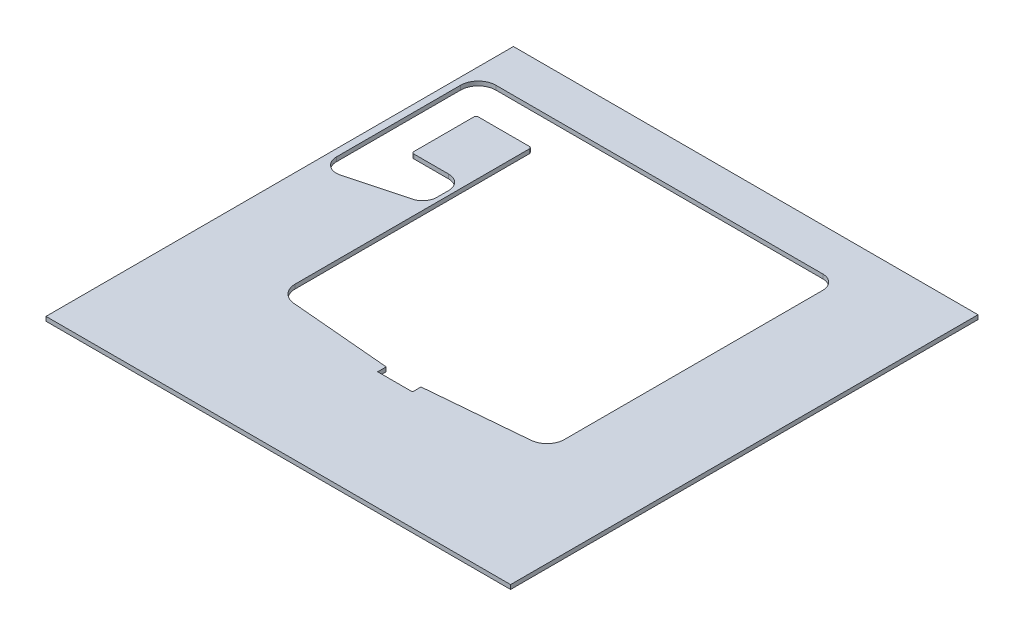
ISO-10303-21;
HEADER;
FILE_DESCRIPTION(('STEP AP214'),'2;1');
FILE_NAME('part.step','',(''),(''),'','','');
FILE_SCHEMA(('AUTOMOTIVE_DESIGN { 1 0 10303 214 1 1 1 1 }'));
ENDSEC;
DATA;
#1=APPLICATION_CONTEXT('core data for automotive mechanical design processes');
#2=APPLICATION_PROTOCOL_DEFINITION('international standard','automotive_design',2000,#1);
#3=PRODUCT_CONTEXT('',#1,'mechanical');
#4=PRODUCT('Part','Part','',(#3));
#5=PRODUCT_RELATED_PRODUCT_CATEGORY('part','',(#4));
#6=PRODUCT_DEFINITION_FORMATION('','',#4);
#7=PRODUCT_DEFINITION_CONTEXT('part definition',#1,'design');
#8=PRODUCT_DEFINITION('design','',#6,#7);
#9=PRODUCT_DEFINITION_SHAPE('','',#8);
#10=(LENGTH_UNIT() NAMED_UNIT(*) SI_UNIT(.MILLI.,.METRE.));
#11=(NAMED_UNIT(*) PLANE_ANGLE_UNIT() SI_UNIT($,.RADIAN.));
#12=(NAMED_UNIT(*) SI_UNIT($,.STERADIAN.) SOLID_ANGLE_UNIT());
#13=UNCERTAINTY_MEASURE_WITH_UNIT(LENGTH_MEASURE(1.E-05),#10,'distance_accuracy_value','');
#14=(GEOMETRIC_REPRESENTATION_CONTEXT(3) GLOBAL_UNCERTAINTY_ASSIGNED_CONTEXT((#13)) GLOBAL_UNIT_ASSIGNED_CONTEXT((#10,
#11,#12)) REPRESENTATION_CONTEXT('',''));
#15=CARTESIAN_POINT('',(0.,0.,0.));
#16=DIRECTION('',(0.,0.,1.));
#17=DIRECTION('',(1.,0.,0.));
#18=AXIS2_PLACEMENT_3D('',#15,#16,#17);
#19=CARTESIAN_POINT('',(0.,866.531199898518,304.23));
#20=DIRECTION('',(0.,0.,-1.));
#21=DIRECTION('',(-1.,0.,0.));
#22=AXIS2_PLACEMENT_3D('',#19,#20,#21);
#23=PLANE('',#22);
#24=DIRECTION('',(1.,0.,0.));
#25=VECTOR('',#24,1.);
#26=CARTESIAN_POINT('',(0.,12.,304.23));
#27=LINE('',#26,#25);
#28=CARTESIAN_POINT('',(-300.,12.,304.23));
#29=VERTEX_POINT('',#28);
#30=CARTESIAN_POINT('',(354.,12.,304.23));
#31=VERTEX_POINT('',#30);
#32=EDGE_CURVE('E314',#29,#31,#27,.T.);
#33=ORIENTED_EDGE('',*,*,#32,.F.);
#34=DIRECTION('',(0.,-1.,0.));
#35=VECTOR('',#34,1.);
#36=CARTESIAN_POINT('',(-300.,866.531199898518,304.23));
#37=LINE('',#36,#35);
#38=CARTESIAN_POINT('',(-300.,6.,304.23));
#39=VERTEX_POINT('',#38);
#40=EDGE_CURVE('E206',#29,#39,#37,.T.);
#41=ORIENTED_EDGE('',*,*,#40,.T.);
#42=DIRECTION('',(1.,0.,0.));
#43=VECTOR('',#42,1.);
#44=CARTESIAN_POINT('',(0.,6.,304.23));
#45=LINE('',#44,#43);
#46=CARTESIAN_POINT('',(354.,6.,304.23));
#47=VERTEX_POINT('',#46);
#48=EDGE_CURVE('E201',#39,#47,#45,.T.);
#49=ORIENTED_EDGE('',*,*,#48,.T.);
#50=DIRECTION('',(0.,1.,0.));
#51=VECTOR('',#50,1.);
#52=CARTESIAN_POINT('',(354.,6.,304.23));
#53=LINE('',#52,#51);
#54=EDGE_CURVE('E204',#47,#31,#53,.T.);
#55=ORIENTED_EDGE('',*,*,#54,.T.);
#56=EDGE_LOOP('',(#33,#41,#49,#55));
#57=FACE_BOUND('',#56,.T.);
#58=ADVANCED_FACE('F17',(#57),#23,.F.);
#59=CARTESIAN_POINT('',(-167.,866.531199898518,-240.23));
#60=DIRECTION('',(0.,-1.,0.));
#61=DIRECTION('',(0.,0.,-1.));
#62=AXIS2_PLACEMENT_3D('',#59,#60,#61);
#63=CYLINDRICAL_SURFACE('',#62,2.99999999999996);
#64=DIRECTION('',(0.,-1.,0.));
#65=VECTOR('',#64,1.);
#66=CARTESIAN_POINT('',(-167.,866.531199898518,-243.23));
#67=LINE('',#66,#65);
#68=CARTESIAN_POINT('',(-167.,12.,-243.23));
#69=VERTEX_POINT('',#68);
#70=CARTESIAN_POINT('',(-167.,6.,-243.23));
#71=VERTEX_POINT('',#70);
#72=EDGE_CURVE('E307',#69,#71,#67,.T.);
#73=ORIENTED_EDGE('',*,*,#72,.F.);
#74=CARTESIAN_POINT('',(-167.,12.,-240.23));
#75=DIRECTION('',(0.,1.,0.));
#76=DIRECTION('',(0.,0.,1.));
#77=AXIS2_PLACEMENT_3D('',#74,#75,#76);
#78=CIRCLE('',#77,2.99999999999996);
#79=CARTESIAN_POINT('',(-164.,12.,-240.23));
#80=VERTEX_POINT('',#79);
#81=EDGE_CURVE('E210',#69,#80,#78,.F.);
#82=ORIENTED_EDGE('',*,*,#81,.T.);
#83=DIRECTION('',(0.,-1.,0.));
#84=VECTOR('',#83,1.);
#85=CARTESIAN_POINT('',(-164.,866.531199898518,-240.23));
#86=LINE('',#85,#84);
#87=CARTESIAN_POINT('',(-164.,6.,-240.23));
#88=VERTEX_POINT('',#87);
#89=EDGE_CURVE('E320',#80,#88,#86,.T.);
#90=ORIENTED_EDGE('',*,*,#89,.T.);
#91=CARTESIAN_POINT('',(-167.,6.,-240.23));
#92=DIRECTION('',(0.,1.,0.));
#93=DIRECTION('',(0.,0.,1.));
#94=AXIS2_PLACEMENT_3D('',#91,#92,#93);
#95=CIRCLE('',#94,2.99999999999996);
#96=EDGE_CURVE('E236',#71,#88,#95,.F.);
#97=ORIENTED_EDGE('',*,*,#96,.F.);
#98=EDGE_LOOP('',(#73,#82,#90,#97));
#99=FACE_BOUND('',#98,.T.);
#100=ADVANCED_FACE('F479',(#99),#63,.T.);
#101=CARTESIAN_POINT('',(0.,866.531199898518,-243.23));
#102=DIRECTION('',(0.,0.,1.));
#103=DIRECTION('',(1.,0.,0.));
#104=AXIS2_PLACEMENT_3D('',#101,#102,#103);
#105=PLANE('',#104);
#106=DIRECTION('',(-1.,0.,0.));
#107=VECTOR('',#106,1.);
#108=CARTESIAN_POINT('',(0.,12.,-243.23));
#109=LINE('',#108,#107);
#110=CARTESIAN_POINT('',(-239.,12.,-243.23));
#111=VERTEX_POINT('',#110);
#112=EDGE_CURVE('E280',#69,#111,#109,.T.);
#113=ORIENTED_EDGE('',*,*,#112,.F.);
#114=ORIENTED_EDGE('',*,*,#72,.T.);
#115=DIRECTION('',(-1.,0.,0.));
#116=VECTOR('',#115,1.);
#117=CARTESIAN_POINT('',(0.,6.,-243.23));
#118=LINE('',#117,#116);
#119=CARTESIAN_POINT('',(-239.,6.,-243.23));
#120=VERTEX_POINT('',#119);
#121=EDGE_CURVE('E304',#71,#120,#118,.T.);
#122=ORIENTED_EDGE('',*,*,#121,.T.);
#123=DIRECTION('',(0.,-1.,0.));
#124=VECTOR('',#123,1.);
#125=CARTESIAN_POINT('',(-239.,866.531199898518,-243.23));
#126=LINE('',#125,#124);
#127=EDGE_CURVE('E303',#111,#120,#126,.T.);
#128=ORIENTED_EDGE('',*,*,#127,.F.);
#129=EDGE_LOOP('',(#113,#114,#122,#128));
#130=FACE_BOUND('',#129,.T.);
#131=ADVANCED_FACE('F489',(#130),#105,.F.);
#132=CARTESIAN_POINT('',(-239.,866.531199898518,-240.23));
#133=DIRECTION('',(0.,-1.,0.));
#134=DIRECTION('',(0.,0.,-1.));
#135=AXIS2_PLACEMENT_3D('',#132,#133,#134);
#136=CYLINDRICAL_SURFACE('',#135,3.00000000000005);
#137=CARTESIAN_POINT('',(-239.,12.,-240.23));
#138=DIRECTION('',(0.,1.,0.));
#139=DIRECTION('',(0.,0.,1.));
#140=AXIS2_PLACEMENT_3D('',#137,#138,#139);
#141=CIRCLE('',#140,3.00000000000005);
#142=CARTESIAN_POINT('',(-242.,12.,-240.23));
#143=VERTEX_POINT('',#142);
#144=EDGE_CURVE('E322',#111,#143,#141,.T.);
#145=ORIENTED_EDGE('',*,*,#144,.F.);
#146=ORIENTED_EDGE('',*,*,#127,.T.);
#147=CARTESIAN_POINT('',(-239.,6.,-240.23));
#148=DIRECTION('',(0.,1.,0.));
#149=DIRECTION('',(0.,0.,1.));
#150=AXIS2_PLACEMENT_3D('',#147,#148,#149);
#151=CIRCLE('',#150,3.00000000000005);
#152=CARTESIAN_POINT('',(-242.,6.,-240.23));
#153=VERTEX_POINT('',#152);
#154=EDGE_CURVE('E300',#120,#153,#151,.T.);
#155=ORIENTED_EDGE('',*,*,#154,.T.);
#156=DIRECTION('',(0.,-1.,0.));
#157=VECTOR('',#156,1.);
#158=CARTESIAN_POINT('',(-242.,866.531199898518,-240.23));
#159=LINE('',#158,#157);
#160=EDGE_CURVE('E299',#143,#153,#159,.T.);
#161=ORIENTED_EDGE('',*,*,#160,.F.);
#162=EDGE_LOOP('',(#145,#146,#155,#161));
#163=FACE_BOUND('',#162,.T.);
#164=ADVANCED_FACE('F495',(#163),#136,.T.);
#165=CARTESIAN_POINT('',(-242.,866.531199898518,0.));
#166=DIRECTION('',(1.,0.,0.));
#167=DIRECTION('',(0.,0.,-1.));
#168=AXIS2_PLACEMENT_3D('',#165,#166,#167);
#169=PLANE('',#168);
#170=DIRECTION('',(0.,0.,1.));
#171=VECTOR('',#170,1.);
#172=CARTESIAN_POINT('',(-242.,12.,0.));
#173=LINE('',#172,#171);
#174=CARTESIAN_POINT('',(-242.,12.,-155.671883561144));
#175=VERTEX_POINT('',#174);
#176=EDGE_CURVE('E324',#143,#175,#173,.T.);
#177=ORIENTED_EDGE('',*,*,#176,.F.);
#178=ORIENTED_EDGE('',*,*,#160,.T.);
#179=DIRECTION('',(0.,0.,1.));
#180=VECTOR('',#179,1.);
#181=CARTESIAN_POINT('',(-242.,6.,0.));
#182=LINE('',#181,#180);
#183=CARTESIAN_POINT('',(-242.,6.,-155.671883561144));
#184=VERTEX_POINT('',#183);
#185=EDGE_CURVE('E296',#153,#184,#182,.T.);
#186=ORIENTED_EDGE('',*,*,#185,.T.);
#187=DIRECTION('',(0.,-1.,0.));
#188=VECTOR('',#187,1.);
#189=CARTESIAN_POINT('',(-242.,866.531199898518,-155.671883561144));
#190=LINE('',#189,#188);
#191=EDGE_CURVE('E295',#175,#184,#190,.T.);
#192=ORIENTED_EDGE('',*,*,#191,.F.);
#193=EDGE_LOOP('',(#177,#178,#186,#192));
#194=FACE_BOUND('',#193,.T.);
#195=ADVANCED_FACE('F497',(#194),#169,.F.);
#196=CARTESIAN_POINT('',(-239.,866.531199898518,-155.671883561144));
#197=DIRECTION('',(0.,-1.,0.));
#198=DIRECTION('',(0.,0.,-1.));
#199=AXIS2_PLACEMENT_3D('',#196,#197,#198);
#200=CYLINDRICAL_SURFACE('',#199,3.00000000000006);
#201=CARTESIAN_POINT('',(-239.,12.,-155.671883561144));
#202=DIRECTION('',(0.,1.,0.));
#203=DIRECTION('',(0.,0.,1.));
#204=AXIS2_PLACEMENT_3D('',#201,#202,#203);
#205=CIRCLE('',#204,3.00000000000006);
#206=CARTESIAN_POINT('',(-239.,12.,-152.671883561143));
#207=VERTEX_POINT('',#206);
#208=EDGE_CURVE('E326',#175,#207,#205,.T.);
#209=ORIENTED_EDGE('',*,*,#208,.F.);
#210=ORIENTED_EDGE('',*,*,#191,.T.);
#211=CARTESIAN_POINT('',(-239.,6.,-155.671883561144));
#212=DIRECTION('',(0.,1.,0.));
#213=DIRECTION('',(0.,0.,1.));
#214=AXIS2_PLACEMENT_3D('',#211,#212,#213);
#215=CIRCLE('',#214,3.00000000000006);
#216=CARTESIAN_POINT('',(-239.,6.,-152.671883561143));
#217=VERTEX_POINT('',#216);
#218=EDGE_CURVE('E292',#184,#217,#215,.T.);
#219=ORIENTED_EDGE('',*,*,#218,.T.);
#220=DIRECTION('',(0.,-1.,0.));
#221=VECTOR('',#220,1.);
#222=CARTESIAN_POINT('',(-239.,866.531199898518,-152.671883561143));
#223=LINE('',#222,#221);
#224=EDGE_CURVE('E291',#207,#217,#223,.T.);
#225=ORIENTED_EDGE('',*,*,#224,.F.);
#226=EDGE_LOOP('',(#209,#210,#219,#225));
#227=FACE_BOUND('',#226,.T.);
#228=ADVANCED_FACE('F502',(#227),#200,.T.);
#229=CARTESIAN_POINT('',(0.,866.531199898518,-152.671883561143));
#230=DIRECTION('',(0.,0.,-1.));
#231=DIRECTION('',(-1.,0.,0.));
#232=AXIS2_PLACEMENT_3D('',#229,#230,#231);
#233=PLANE('',#232);
#234=DIRECTION('',(1.,0.,0.));
#235=VECTOR('',#234,1.);
#236=CARTESIAN_POINT('',(0.,6.,-152.671883561143));
#237=LINE('',#236,#235);
#238=CARTESIAN_POINT('',(-190.,6.,-152.671883561143));
#239=VERTEX_POINT('',#238);
#240=EDGE_CURVE('E288',#217,#239,#237,.T.);
#241=ORIENTED_EDGE('',*,*,#240,.T.);
#242=DIRECTION('',(0.,-1.,0.));
#243=VECTOR('',#242,1.);
#244=CARTESIAN_POINT('',(-190.,12.,-152.671883561143));
#245=LINE('',#244,#243);
#246=CARTESIAN_POINT('',(-190.,12.,-152.671883561143));
#247=VERTEX_POINT('',#246);
#248=EDGE_CURVE('E388',#239,#247,#245,.F.);
#249=ORIENTED_EDGE('',*,*,#248,.T.);
#250=DIRECTION('',(1.,0.,0.));
#251=VECTOR('',#250,1.);
#252=CARTESIAN_POINT('',(0.,12.,-152.671883561143));
#253=LINE('',#252,#251);
#254=EDGE_CURVE('E328',#207,#247,#253,.T.);
#255=ORIENTED_EDGE('',*,*,#254,.F.);
#256=ORIENTED_EDGE('',*,*,#224,.T.);
#257=EDGE_LOOP('',(#241,#249,#255,#256));
#258=FACE_BOUND('',#257,.T.);
#259=ADVANCED_FACE('F580',(#258),#233,.F.);
#260=CARTESIAN_POINT('',(-170.,866.531199898518,0.));
#261=DIRECTION('',(1.,0.,0.));
#262=DIRECTION('',(0.,0.,-1.));
#263=AXIS2_PLACEMENT_3D('',#260,#261,#262);
#264=PLANE('',#263);
#265=DIRECTION('',(0.,0.,1.));
#266=VECTOR('',#265,1.);
#267=CARTESIAN_POINT('',(-170.,12.,0.));
#268=LINE('',#267,#266);
#269=CARTESIAN_POINT('',(-170.,12.,-132.671883561143));
#270=VERTEX_POINT('',#269);
#271=CARTESIAN_POINT('',(-170.,12.,-116.018423320723));
#272=VERTEX_POINT('',#271);
#273=EDGE_CURVE('E331',#270,#272,#268,.T.);
#274=ORIENTED_EDGE('',*,*,#273,.F.);
#275=DIRECTION('',(0.,-1.,0.));
#276=VECTOR('',#275,1.);
#277=CARTESIAN_POINT('',(-170.,6.,-132.671883561143));
#278=LINE('',#277,#276);
#279=CARTESIAN_POINT('',(-170.,6.,-132.671883561143));
#280=VERTEX_POINT('',#279);
#281=EDGE_CURVE('E385',#270,#280,#278,.T.);
#282=ORIENTED_EDGE('',*,*,#281,.T.);
#283=DIRECTION('',(0.,0.,1.));
#284=VECTOR('',#283,1.);
#285=CARTESIAN_POINT('',(-170.,6.,0.));
#286=LINE('',#285,#284);
#287=CARTESIAN_POINT('',(-170.,6.,-116.018423320723));
#288=VERTEX_POINT('',#287);
#289=EDGE_CURVE('E285',#280,#288,#286,.T.);
#290=ORIENTED_EDGE('',*,*,#289,.T.);
#291=DIRECTION('',(0.,-1.,0.));
#292=VECTOR('',#291,1.);
#293=CARTESIAN_POINT('',(-170.,12.,-116.018423320723));
#294=LINE('',#293,#292);
#295=EDGE_CURVE('E316',#288,#272,#294,.F.);
#296=ORIENTED_EDGE('',*,*,#295,.T.);
#297=EDGE_LOOP('',(#274,#282,#290,#296));
#298=FACE_BOUND('',#297,.T.);
#299=ADVANCED_FACE('F513',(#298),#264,.F.);
#300=CARTESIAN_POINT('',(-36.5558115686076,866.531199898518,-136.428146085961));
#301=DIRECTION('',(0.258819045102515,0.,0.96592582628907));
#302=DIRECTION('',(0.96592582628907,0.,-0.258819045102515));
#303=AXIS2_PLACEMENT_3D('',#300,#301,#302);
#304=PLANE('',#303);
#305=DIRECTION('',(-0.96592582628907,0.,0.258819045102515));
#306=VECTOR('',#305,1.);
#307=CARTESIAN_POINT('',(-36.5558115686076,12.,-136.428146085961));
#308=LINE('',#307,#306);
#309=CARTESIAN_POINT('',(-184.82361909795,12.,-96.6999067949414));
#310=VERTEX_POINT('',#309);
#311=CARTESIAN_POINT('',(-264.82361909795,12.,-75.2639714004523));
#312=VERTEX_POINT('',#311);
#313=EDGE_CURVE('E334',#310,#312,#308,.T.);
#314=ORIENTED_EDGE('',*,*,#313,.F.);
#315=DIRECTION('',(0.,-1.,0.));
#316=VECTOR('',#315,1.);
#317=CARTESIAN_POINT('',(-184.82361909795,6.,-96.6999067949414));
#318=LINE('',#317,#316);
#319=CARTESIAN_POINT('',(-184.82361909795,6.,-96.6999067949414));
#320=VERTEX_POINT('',#319);
#321=EDGE_CURVE('E392',#310,#320,#318,.T.);
#322=ORIENTED_EDGE('',*,*,#321,.T.);
#323=DIRECTION('',(-0.96592582628907,0.,0.258819045102515));
#324=VECTOR('',#323,1.);
#325=CARTESIAN_POINT('',(-36.5558115686076,6.,-136.428146085961));
#326=LINE('',#325,#324);
#327=CARTESIAN_POINT('',(-264.82361909795,6.,-75.2639714004523));
#328=VERTEX_POINT('',#327);
#329=EDGE_CURVE('E281',#320,#328,#326,.T.);
#330=ORIENTED_EDGE('',*,*,#329,.T.);
#331=DIRECTION('',(0.,-1.,0.));
#332=VECTOR('',#331,1.);
#333=CARTESIAN_POINT('',(-264.82361909795,866.531199898518,-75.2639714004523));
#334=LINE('',#333,#332);
#335=EDGE_CURVE('E390',#328,#312,#334,.F.);
#336=ORIENTED_EDGE('',*,*,#335,.T.);
#337=EDGE_LOOP('',(#314,#322,#330,#336));
#338=FACE_BOUND('',#337,.T.);
#339=ADVANCED_FACE('F418',(#338),#304,.F.);
#340=CARTESIAN_POINT('',(-290.,866.531199898518,0.));
#341=DIRECTION('',(1.,0.,0.));
#342=DIRECTION('',(0.,0.,-1.));
#343=AXIS2_PLACEMENT_3D('',#340,#341,#342);
#344=PLANE('',#343);
#345=DIRECTION('',(0.,0.,1.));
#346=VECTOR('',#345,1.);
#347=CARTESIAN_POINT('',(-290.,12.,0.));
#348=LINE('',#347,#346);
#349=CARTESIAN_POINT('',(-290.,12.,-269.23));
#350=VERTEX_POINT('',#349);
#351=CARTESIAN_POINT('',(-290.,12.,-94.5824879262337));
#352=VERTEX_POINT('',#351);
#353=EDGE_CURVE('E284',#350,#352,#348,.T.);
#354=ORIENTED_EDGE('',*,*,#353,.T.);
#355=DIRECTION('',(0.,-1.,0.));
#356=VECTOR('',#355,1.);
#357=CARTESIAN_POINT('',(-290.,866.531199898518,-94.5824879262337));
#358=LINE('',#357,#356);
#359=CARTESIAN_POINT('',(-290.,6.,-94.5824879262337));
#360=VERTEX_POINT('',#359);
#361=EDGE_CURVE('E400',#352,#360,#358,.T.);
#362=ORIENTED_EDGE('',*,*,#361,.T.);
#363=DIRECTION('',(0.,0.,1.));
#364=VECTOR('',#363,1.);
#365=CARTESIAN_POINT('',(-290.,6.,0.));
#366=LINE('',#365,#364);
#367=CARTESIAN_POINT('',(-290.,6.,-269.23));
#368=VERTEX_POINT('',#367);
#369=EDGE_CURVE('E277',#368,#360,#366,.T.);
#370=ORIENTED_EDGE('',*,*,#369,.F.);
#371=DIRECTION('',(0.,-1.,0.));
#372=VECTOR('',#371,1.);
#373=CARTESIAN_POINT('',(-290.,866.531199898518,-269.23));
#374=LINE('',#373,#372);
#375=EDGE_CURVE('E341',#350,#368,#374,.T.);
#376=ORIENTED_EDGE('',*,*,#375,.F.);
#377=EDGE_LOOP('',(#354,#362,#370,#376));
#378=FACE_BOUND('',#377,.T.);
#379=ADVANCED_FACE('F421',(#378),#344,.T.);
#380=CARTESIAN_POINT('',(-265.,866.531199898518,-269.23));
#381=DIRECTION('',(0.,-1.,0.));
#382=DIRECTION('',(0.,0.,-1.));
#383=AXIS2_PLACEMENT_3D('',#380,#381,#382);
#384=CYLINDRICAL_SURFACE('',#383,25.);
#385=DIRECTION('',(0.,-1.,0.));
#386=VECTOR('',#385,1.);
#387=CARTESIAN_POINT('',(-265.,866.531199898518,-294.23));
#388=LINE('',#387,#386);
#389=CARTESIAN_POINT('',(-265.,12.,-294.23));
#390=VERTEX_POINT('',#389);
#391=CARTESIAN_POINT('',(-265.,6.,-294.23));
#392=VERTEX_POINT('',#391);
#393=EDGE_CURVE('E272',#390,#392,#388,.T.);
#394=ORIENTED_EDGE('',*,*,#393,.F.);
#395=CARTESIAN_POINT('',(-265.,12.,-269.23));
#396=DIRECTION('',(0.,1.,0.));
#397=DIRECTION('',(0.,0.,1.));
#398=AXIS2_PLACEMENT_3D('',#395,#396,#397);
#399=CIRCLE('',#398,25.);
#400=EDGE_CURVE('E338',#390,#350,#399,.T.);
#401=ORIENTED_EDGE('',*,*,#400,.T.);
#402=ORIENTED_EDGE('',*,*,#375,.T.);
#403=CARTESIAN_POINT('',(-265.,6.,-269.23));
#404=DIRECTION('',(0.,1.,0.));
#405=DIRECTION('',(0.,0.,1.));
#406=AXIS2_PLACEMENT_3D('',#403,#404,#405);
#407=CIRCLE('',#406,25.);
#408=EDGE_CURVE('E274',#392,#368,#407,.T.);
#409=ORIENTED_EDGE('',*,*,#408,.F.);
#410=EDGE_LOOP('',(#394,#401,#402,#409));
#411=FACE_BOUND('',#410,.T.);
#412=ADVANCED_FACE('F431',(#411),#384,.F.);
#413=CARTESIAN_POINT('',(0.,866.531199898518,-294.23));
#414=DIRECTION('',(0.,0.,1.));
#415=DIRECTION('',(1.,0.,0.));
#416=AXIS2_PLACEMENT_3D('',#413,#414,#415);
#417=PLANE('',#416);
#418=DIRECTION('',(-1.,0.,0.));
#419=VECTOR('',#418,1.);
#420=CARTESIAN_POINT('',(0.,6.,-294.23));
#421=LINE('',#420,#419);
#422=CARTESIAN_POINT('',(195.,6.,-294.23));
#423=VERTEX_POINT('',#422);
#424=EDGE_CURVE('E264',#423,#392,#421,.T.);
#425=ORIENTED_EDGE('',*,*,#424,.F.);
#426=DIRECTION('',(0.,-1.,0.));
#427=VECTOR('',#426,1.);
#428=CARTESIAN_POINT('',(195.,866.531199898518,-294.23));
#429=LINE('',#428,#427);
#430=CARTESIAN_POINT('',(195.,12.,-294.23));
#431=VERTEX_POINT('',#430);
#432=EDGE_CURVE('E398',#423,#431,#429,.F.);
#433=ORIENTED_EDGE('',*,*,#432,.T.);
#434=DIRECTION('',(-1.,0.,0.));
#435=VECTOR('',#434,1.);
#436=CARTESIAN_POINT('',(0.,12.,-294.23));
#437=LINE('',#436,#435);
#438=EDGE_CURVE('E342',#431,#390,#437,.T.);
#439=ORIENTED_EDGE('',*,*,#438,.T.);
#440=ORIENTED_EDGE('',*,*,#393,.T.);
#441=EDGE_LOOP('',(#425,#433,#439,#440));
#442=FACE_BOUND('',#441,.T.);
#443=ADVANCED_FACE('F434',(#442),#417,.T.);
#444=CARTESIAN_POINT('',(215.,866.531199898518,0.));
#445=DIRECTION('',(1.,0.,0.));
#446=DIRECTION('',(0.,0.,-1.));
#447=AXIS2_PLACEMENT_3D('',#444,#445,#446);
#448=PLANE('',#447);
#449=DIRECTION('',(0.,0.,1.));
#450=VECTOR('',#449,1.);
#451=CARTESIAN_POINT('',(215.,12.,0.));
#452=LINE('',#451,#450);
#453=CARTESIAN_POINT('',(215.,12.,-274.23));
#454=VERTEX_POINT('',#453);
#455=CARTESIAN_POINT('',(215.,12.,89.4614676103922));
#456=VERTEX_POINT('',#455);
#457=EDGE_CURVE('E336',#454,#456,#452,.T.);
#458=ORIENTED_EDGE('',*,*,#457,.F.);
#459=DIRECTION('',(0.,-1.,0.));
#460=VECTOR('',#459,1.);
#461=CARTESIAN_POINT('',(215.,866.531199898518,-274.23));
#462=LINE('',#461,#460);
#463=CARTESIAN_POINT('',(215.,6.,-274.23));
#464=VERTEX_POINT('',#463);
#465=EDGE_CURVE('E395',#454,#464,#462,.T.);
#466=ORIENTED_EDGE('',*,*,#465,.T.);
#467=DIRECTION('',(0.,0.,1.));
#468=VECTOR('',#467,1.);
#469=CARTESIAN_POINT('',(215.,6.,0.));
#470=LINE('',#469,#468);
#471=CARTESIAN_POINT('',(215.,6.,89.4614676103922));
#472=VERTEX_POINT('',#471);
#473=EDGE_CURVE('E270',#464,#472,#470,.T.);
#474=ORIENTED_EDGE('',*,*,#473,.T.);
#475=DIRECTION('',(0.,-1.,0.));
#476=VECTOR('',#475,1.);
#477=CARTESIAN_POINT('',(215.,866.531199898518,89.4614676103922));
#478=LINE('',#477,#476);
#479=EDGE_CURVE('E269',#456,#472,#478,.T.);
#480=ORIENTED_EDGE('',*,*,#479,.F.);
#481=EDGE_LOOP('',(#458,#466,#474,#480));
#482=FACE_BOUND('',#481,.T.);
#483=ADVANCED_FACE('F442',(#482),#448,.F.);
#484=CARTESIAN_POINT('',(190.5,866.531199898518,89.4614676103922));
#485=DIRECTION('',(0.,-1.,0.));
#486=DIRECTION('',(0.,0.,-1.));
#487=AXIS2_PLACEMENT_3D('',#484,#485,#486);
#488=CYLINDRICAL_SURFACE('',#487,24.5);
#489=CARTESIAN_POINT('',(190.5,12.,89.4614676103922));
#490=DIRECTION('',(0.,1.,0.));
#491=DIRECTION('',(0.,0.,1.));
#492=AXIS2_PLACEMENT_3D('',#489,#490,#491);
#493=CIRCLE('',#492,24.5);
#494=CARTESIAN_POINT('',(192.635315697318,12.,113.86823771364));
#495=VERTEX_POINT('',#494);
#496=EDGE_CURVE('E345',#456,#495,#493,.F.);
#497=ORIENTED_EDGE('',*,*,#496,.F.);
#498=ORIENTED_EDGE('',*,*,#479,.T.);
#499=CARTESIAN_POINT('',(190.5,6.,89.4614676103922));
#500=DIRECTION('',(0.,1.,0.));
#501=DIRECTION('',(0.,0.,1.));
#502=AXIS2_PLACEMENT_3D('',#499,#500,#501);
#503=CIRCLE('',#502,24.5);
#504=CARTESIAN_POINT('',(192.635315697318,6.,113.86823771364));
#505=VERTEX_POINT('',#504);
#506=EDGE_CURVE('E265',#472,#505,#503,.F.);
#507=ORIENTED_EDGE('',*,*,#506,.T.);
#508=DIRECTION('',(0.,-1.,0.));
#509=VECTOR('',#508,1.);
#510=CARTESIAN_POINT('',(192.635315697318,866.531199898518,113.86823771364));
#511=LINE('',#510,#509);
#512=EDGE_CURVE('E350',#495,#505,#511,.T.);
#513=ORIENTED_EDGE('',*,*,#512,.F.);
#514=EDGE_LOOP('',(#497,#498,#507,#513));
#515=FACE_BOUND('',#514,.T.);
#516=ADVANCED_FACE('F448',(#515),#488,.F.);
#517=CARTESIAN_POINT('',(11.3497876338818,866.531199898518,129.728666280502));
#518=DIRECTION('',(-0.0871557427476589,0.,-0.996194698091745));
#519=DIRECTION('',(-0.996194698091746,0.,0.0871557427476589));
#520=AXIS2_PLACEMENT_3D('',#517,#518,#519);
#521=PLANE('',#520);
#522=DIRECTION('',(0.,-1.,0.));
#523=VECTOR('',#522,1.);
#524=CARTESIAN_POINT('',(50.0000000000006,866.531199898518,126.347210855597));
#525=LINE('',#524,#523);
#526=CARTESIAN_POINT('',(50.0000000000006,12.,126.347210855597));
#527=VERTEX_POINT('',#526);
#528=CARTESIAN_POINT('',(50.0000000000006,6.,126.347210855597));
#529=VERTEX_POINT('',#528);
#530=EDGE_CURVE('E261',#527,#529,#525,.T.);
#531=ORIENTED_EDGE('',*,*,#530,.F.);
#532=DIRECTION('',(0.996194698091746,0.,-0.0871557427476589));
#533=VECTOR('',#532,1.);
#534=CARTESIAN_POINT('',(11.3497876338818,12.,129.728666280502));
#535=LINE('',#534,#533);
#536=EDGE_CURVE('E268',#527,#495,#535,.T.);
#537=ORIENTED_EDGE('',*,*,#536,.T.);
#538=ORIENTED_EDGE('',*,*,#512,.T.);
#539=DIRECTION('',(0.996194698091746,0.,-0.0871557427476589));
#540=VECTOR('',#539,1.);
#541=CARTESIAN_POINT('',(11.3497876338818,6.,129.728666280502));
#542=LINE('',#541,#540);
#543=EDGE_CURVE('E256',#529,#505,#542,.T.);
#544=ORIENTED_EDGE('',*,*,#543,.F.);
#545=EDGE_LOOP('',(#531,#537,#538,#544));
#546=FACE_BOUND('',#545,.T.);
#547=ADVANCED_FACE('F454',(#546),#521,.T.);
#548=CARTESIAN_POINT('',(50.0000000000006,866.531199898518,0.));
#549=DIRECTION('',(1.,0.,0.));
#550=DIRECTION('',(0.,0.,-1.));
#551=AXIS2_PLACEMENT_3D('',#548,#549,#550);
#552=PLANE('',#551);
#553=DIRECTION('',(0.,0.,1.));
#554=VECTOR('',#553,1.);
#555=CARTESIAN_POINT('',(50.0000000000006,12.,0.));
#556=LINE('',#555,#554);
#557=CARTESIAN_POINT('',(50.0000000000006,12.,138.347210855597));
#558=VERTEX_POINT('',#557);
#559=EDGE_CURVE('E347',#527,#558,#556,.T.);
#560=ORIENTED_EDGE('',*,*,#559,.F.);
#561=ORIENTED_EDGE('',*,*,#530,.T.);
#562=DIRECTION('',(0.,0.,1.));
#563=VECTOR('',#562,1.);
#564=CARTESIAN_POINT('',(50.0000000000006,6.,0.));
#565=LINE('',#564,#563);
#566=CARTESIAN_POINT('',(50.0000000000006,6.,138.347210855597));
#567=VERTEX_POINT('',#566);
#568=EDGE_CURVE('E257',#529,#567,#565,.T.);
#569=ORIENTED_EDGE('',*,*,#568,.T.);
#570=DIRECTION('',(0.,-1.,0.));
#571=VECTOR('',#570,1.);
#572=CARTESIAN_POINT('',(50.0000000000006,866.531199898518,138.347210855597));
#573=LINE('',#572,#571);
#574=EDGE_CURVE('E355',#558,#567,#573,.T.);
#575=ORIENTED_EDGE('',*,*,#574,.F.);
#576=EDGE_LOOP('',(#560,#561,#569,#575));
#577=FACE_BOUND('',#576,.T.);
#578=ADVANCED_FACE('F457',(#577),#552,.F.);
#579=CARTESIAN_POINT('',(0.,866.531199898518,138.347210855597));
#580=DIRECTION('',(0.,0.,-1.));
#581=DIRECTION('',(-1.,0.,0.));
#582=AXIS2_PLACEMENT_3D('',#579,#580,#581);
#583=PLANE('',#582);
#584=DIRECTION('',(0.,-1.,0.));
#585=VECTOR('',#584,1.);
#586=CARTESIAN_POINT('',(1.00000000000035,866.531199898518,138.347210855597));
#587=LINE('',#586,#585);
#588=CARTESIAN_POINT('',(1.00000000000035,12.,138.347210855597));
#589=VERTEX_POINT('',#588);
#590=CARTESIAN_POINT('',(1.00000000000035,6.,138.347210855597));
#591=VERTEX_POINT('',#590);
#592=EDGE_CURVE('E359',#589,#591,#587,.T.);
#593=ORIENTED_EDGE('',*,*,#592,.F.);
#594=DIRECTION('',(1.,0.,0.));
#595=VECTOR('',#594,1.);
#596=CARTESIAN_POINT('',(0.,12.,138.347210855597));
#597=LINE('',#596,#595);
#598=EDGE_CURVE('E260',#589,#558,#597,.T.);
#599=ORIENTED_EDGE('',*,*,#598,.T.);
#600=ORIENTED_EDGE('',*,*,#574,.T.);
#601=DIRECTION('',(1.,0.,0.));
#602=VECTOR('',#601,1.);
#603=CARTESIAN_POINT('',(0.,6.,138.347210855597));
#604=LINE('',#603,#602);
#605=EDGE_CURVE('E253',#591,#567,#604,.T.);
#606=ORIENTED_EDGE('',*,*,#605,.F.);
#607=EDGE_LOOP('',(#593,#599,#600,#606));
#608=FACE_BOUND('',#607,.T.);
#609=ADVANCED_FACE('F461',(#608),#583,.T.);
#610=CARTESIAN_POINT('',(1.00000000000035,866.531199898518,0.));
#611=DIRECTION('',(1.,0.,0.));
#612=DIRECTION('',(0.,0.,-1.));
#613=AXIS2_PLACEMENT_3D('',#610,#611,#612);
#614=PLANE('',#613);
#615=DIRECTION('',(0.,-1.,0.));
#616=VECTOR('',#615,1.);
#617=CARTESIAN_POINT('',(1.00000000000035,866.531199898518,126.347210855597));
#618=LINE('',#617,#616);
#619=CARTESIAN_POINT('',(1.00000000000035,12.,126.347210855597));
#620=VERTEX_POINT('',#619);
#621=CARTESIAN_POINT('',(1.00000000000035,6.,126.347210855597));
#622=VERTEX_POINT('',#621);
#623=EDGE_CURVE('E250',#620,#622,#618,.T.);
#624=ORIENTED_EDGE('',*,*,#623,.F.);
#625=DIRECTION('',(0.,0.,1.));
#626=VECTOR('',#625,1.);
#627=CARTESIAN_POINT('',(1.00000000000035,12.,0.));
#628=LINE('',#627,#626);
#629=EDGE_CURVE('E356',#620,#589,#628,.T.);
#630=ORIENTED_EDGE('',*,*,#629,.T.);
#631=ORIENTED_EDGE('',*,*,#592,.T.);
#632=DIRECTION('',(0.,0.,1.));
#633=VECTOR('',#632,1.);
#634=CARTESIAN_POINT('',(1.00000000000035,6.,0.));
#635=LINE('',#634,#633);
#636=EDGE_CURVE('E245',#622,#591,#635,.T.);
#637=ORIENTED_EDGE('',*,*,#636,.F.);
#638=EDGE_LOOP('',(#624,#630,#631,#637));
#639=FACE_BOUND('',#638,.T.);
#640=ADVANCED_FACE('F467',(#639),#614,.T.);
#641=CARTESIAN_POINT('',(-10.9623853356931,866.531199898518,125.300637749995));
#642=DIRECTION('',(-0.0871557427476588,0.,0.996194698091745));
#643=DIRECTION('',(0.996194698091746,0.,0.0871557427476589));
#644=AXIS2_PLACEMENT_3D('',#641,#642,#643);
#645=PLANE('',#644);
#646=DIRECTION('',(-0.996194698091746,0.,-0.0871557427476589));
#647=VECTOR('',#646,1.);
#648=CARTESIAN_POINT('',(-10.9623853356931,12.,125.300637749995));
#649=LINE('',#648,#647);
#650=CARTESIAN_POINT('',(-141.635315697318,12.,113.86823771364));
#651=VERTEX_POINT('',#650);
#652=EDGE_CURVE('E352',#620,#651,#649,.T.);
#653=ORIENTED_EDGE('',*,*,#652,.F.);
#654=ORIENTED_EDGE('',*,*,#623,.T.);
#655=DIRECTION('',(-0.996194698091746,0.,-0.0871557427476589));
#656=VECTOR('',#655,1.);
#657=CARTESIAN_POINT('',(-10.9623853356931,6.,125.300637749995));
#658=LINE('',#657,#656);
#659=CARTESIAN_POINT('',(-141.635315697318,6.,113.86823771364));
#660=VERTEX_POINT('',#659);
#661=EDGE_CURVE('E246',#622,#660,#658,.T.);
#662=ORIENTED_EDGE('',*,*,#661,.T.);
#663=DIRECTION('',(0.,-1.,0.));
#664=VECTOR('',#663,1.);
#665=CARTESIAN_POINT('',(-141.635315697318,866.531199898518,113.86823771364));
#666=LINE('',#665,#664);
#667=EDGE_CURVE('E313',#651,#660,#666,.T.);
#668=ORIENTED_EDGE('',*,*,#667,.F.);
#669=EDGE_LOOP('',(#653,#654,#662,#668));
#670=FACE_BOUND('',#669,.T.);
#671=ADVANCED_FACE('F470',(#670),#645,.F.);
#672=CARTESIAN_POINT('',(-139.5,866.531199898518,89.4614676103922));
#673=DIRECTION('',(0.,-1.,0.));
#674=DIRECTION('',(0.,0.,-1.));
#675=AXIS2_PLACEMENT_3D('',#672,#673,#674);
#676=CYLINDRICAL_SURFACE('',#675,24.5);
#677=DIRECTION('',(0.,-1.,0.));
#678=VECTOR('',#677,1.);
#679=CARTESIAN_POINT('',(-164.,866.531199898518,89.4614676103922));
#680=LINE('',#679,#678);
#681=CARTESIAN_POINT('',(-164.,12.,89.4614676103922));
#682=VERTEX_POINT('',#681);
#683=CARTESIAN_POINT('',(-164.,6.,89.4614676103922));
#684=VERTEX_POINT('',#683);
#685=EDGE_CURVE('E237',#682,#684,#680,.T.);
#686=ORIENTED_EDGE('',*,*,#685,.F.);
#687=CARTESIAN_POINT('',(-139.5,12.,89.4614676103922));
#688=DIRECTION('',(0.,1.,0.));
#689=DIRECTION('',(0.,0.,1.));
#690=AXIS2_PLACEMENT_3D('',#687,#688,#689);
#691=CIRCLE('',#690,24.5);
#692=EDGE_CURVE('E249',#682,#651,#691,.T.);
#693=ORIENTED_EDGE('',*,*,#692,.T.);
#694=ORIENTED_EDGE('',*,*,#667,.T.);
#695=CARTESIAN_POINT('',(-139.5,6.,89.4614676103922));
#696=DIRECTION('',(0.,1.,0.));
#697=DIRECTION('',(0.,0.,1.));
#698=AXIS2_PLACEMENT_3D('',#695,#696,#697);
#699=CIRCLE('',#698,24.5);
#700=EDGE_CURVE('E242',#684,#660,#699,.T.);
#701=ORIENTED_EDGE('',*,*,#700,.F.);
#702=EDGE_LOOP('',(#686,#693,#694,#701));
#703=FACE_BOUND('',#702,.T.);
#704=ADVANCED_FACE('F474',(#703),#676,.F.);
#705=CARTESIAN_POINT('',(-164.,866.531199898518,0.));
#706=DIRECTION('',(1.,0.,0.));
#707=DIRECTION('',(0.,0.,-1.));
#708=AXIS2_PLACEMENT_3D('',#705,#706,#707);
#709=PLANE('',#708);
#710=ORIENTED_EDGE('',*,*,#89,.F.);
#711=DIRECTION('',(0.,0.,1.));
#712=VECTOR('',#711,1.);
#713=CARTESIAN_POINT('',(-164.,12.,0.));
#714=LINE('',#713,#712);
#715=EDGE_CURVE('E310',#80,#682,#714,.T.);
#716=ORIENTED_EDGE('',*,*,#715,.T.);
#717=ORIENTED_EDGE('',*,*,#685,.T.);
#718=DIRECTION('',(0.,0.,1.));
#719=VECTOR('',#718,1.);
#720=CARTESIAN_POINT('',(-164.,6.,0.));
#721=LINE('',#720,#719);
#722=EDGE_CURVE('E239',#88,#684,#721,.T.);
#723=ORIENTED_EDGE('',*,*,#722,.F.);
#724=EDGE_LOOP('',(#710,#716,#717,#723));
#725=FACE_BOUND('',#724,.T.);
#726=ADVANCED_FACE('F483',(#725),#709,.T.);
#727=CARTESIAN_POINT('',(-300.,866.531199898518,0.));
#728=DIRECTION('',(1.,0.,0.));
#729=DIRECTION('',(0.,0.,-1.));
#730=AXIS2_PLACEMENT_3D('',#727,#728,#729);
#731=PLANE('',#730);
#732=DIRECTION('',(0.,0.,1.));
#733=VECTOR('',#732,1.);
#734=CARTESIAN_POINT('',(-300.,12.,0.));
#735=LINE('',#734,#733);
#736=CARTESIAN_POINT('',(-300.,12.,-353.77));
#737=VERTEX_POINT('',#736);
#738=EDGE_CURVE('E317',#737,#29,#735,.T.);
#739=ORIENTED_EDGE('',*,*,#738,.F.);
#740=DIRECTION('',(0.,1.,0.));
#741=VECTOR('',#740,1.);
#742=CARTESIAN_POINT('',(-300.,6.,-353.77));
#743=LINE('',#742,#741);
#744=CARTESIAN_POINT('',(-300.,6.,-353.77));
#745=VERTEX_POINT('',#744);
#746=EDGE_CURVE('E231',#745,#737,#743,.T.);
#747=ORIENTED_EDGE('',*,*,#746,.F.);
#748=DIRECTION('',(0.,0.,1.));
#749=VECTOR('',#748,1.);
#750=CARTESIAN_POINT('',(-300.,6.,0.));
#751=LINE('',#750,#749);
#752=EDGE_CURVE('E235',#745,#39,#751,.T.);
#753=ORIENTED_EDGE('',*,*,#752,.T.);
#754=ORIENTED_EDGE('',*,*,#40,.F.);
#755=EDGE_LOOP('',(#739,#747,#753,#754));
#756=FACE_BOUND('',#755,.T.);
#757=ADVANCED_FACE('F537',(#756),#731,.F.);
#758=CARTESIAN_POINT('',(0.,6.,0.));
#759=DIRECTION('',(0.,1.,0.));
#760=DIRECTION('',(0.,0.,1.));
#761=AXIS2_PLACEMENT_3D('',#758,#759,#760);
#762=PLANE('',#761);
#763=ORIENTED_EDGE('',*,*,#96,.T.);
#764=ORIENTED_EDGE('',*,*,#722,.T.);
#765=ORIENTED_EDGE('',*,*,#700,.T.);
#766=ORIENTED_EDGE('',*,*,#661,.F.);
#767=ORIENTED_EDGE('',*,*,#636,.T.);
#768=ORIENTED_EDGE('',*,*,#605,.T.);
#769=ORIENTED_EDGE('',*,*,#568,.F.);
#770=ORIENTED_EDGE('',*,*,#543,.T.);
#771=ORIENTED_EDGE('',*,*,#506,.F.);
#772=ORIENTED_EDGE('',*,*,#473,.F.);
#773=CARTESIAN_POINT('',(195.,6.,-274.23));
#774=DIRECTION('',(0.,1.,0.));
#775=DIRECTION('',(0.,0.,1.));
#776=AXIS2_PLACEMENT_3D('',#773,#774,#775);
#777=CIRCLE('',#776,20.);
#778=EDGE_CURVE('E410',#464,#423,#777,.T.);
#779=ORIENTED_EDGE('',*,*,#778,.T.);
#780=ORIENTED_EDGE('',*,*,#424,.T.);
#781=ORIENTED_EDGE('',*,*,#408,.T.);
#782=ORIENTED_EDGE('',*,*,#369,.T.);
#783=CARTESIAN_POINT('',(-270.,6.,-94.5824879262337));
#784=DIRECTION('',(0.,1.,0.));
#785=DIRECTION('',(0.,0.,1.));
#786=AXIS2_PLACEMENT_3D('',#783,#784,#785);
#787=CIRCLE('',#786,20.);
#788=EDGE_CURVE('E25',#360,#328,#787,.T.);
#789=ORIENTED_EDGE('',*,*,#788,.T.);
#790=ORIENTED_EDGE('',*,*,#329,.F.);
#791=CARTESIAN_POINT('',(-190.,6.,-116.018423320723));
#792=DIRECTION('',(0.,1.,0.));
#793=DIRECTION('',(0.,0.,1.));
#794=AXIS2_PLACEMENT_3D('',#791,#792,#793);
#795=CIRCLE('',#794,20.);
#796=EDGE_CURVE('E406',#320,#288,#795,.T.);
#797=ORIENTED_EDGE('',*,*,#796,.T.);
#798=ORIENTED_EDGE('',*,*,#289,.F.);
#799=CARTESIAN_POINT('',(-190.,6.,-132.671883561143));
#800=DIRECTION('',(0.,1.,0.));
#801=DIRECTION('',(0.,0.,1.));
#802=AXIS2_PLACEMENT_3D('',#799,#800,#801);
#803=CIRCLE('',#802,20.);
#804=EDGE_CURVE('E402',#280,#239,#803,.T.);
#805=ORIENTED_EDGE('',*,*,#804,.T.);
#806=ORIENTED_EDGE('',*,*,#240,.F.);
#807=ORIENTED_EDGE('',*,*,#218,.F.);
#808=ORIENTED_EDGE('',*,*,#185,.F.);
#809=ORIENTED_EDGE('',*,*,#154,.F.);
#810=ORIENTED_EDGE('',*,*,#121,.F.);
#811=EDGE_LOOP('',(#763,#764,#765,#766,#767,#768,#769,#770,#771,#772,#779,#780,#781,#782,#789,
#790,#797,#798,#805,#806,#807,#808,#809,#810));
#812=FACE_BOUND('',#811,.T.);
#813=ORIENTED_EDGE('',*,*,#48,.F.);
#814=ORIENTED_EDGE('',*,*,#752,.F.);
#815=DIRECTION('',(-1.,0.,0.));
#816=VECTOR('',#815,1.);
#817=CARTESIAN_POINT('',(354.,6.,-353.77));
#818=LINE('',#817,#816);
#819=CARTESIAN_POINT('',(354.,6.,-353.77));
#820=VERTEX_POINT('',#819);
#821=EDGE_CURVE('E219',#820,#745,#818,.T.);
#822=ORIENTED_EDGE('',*,*,#821,.F.);
#823=DIRECTION('',(0.,0.,-1.));
#824=VECTOR('',#823,1.);
#825=CARTESIAN_POINT('',(354.,6.,304.23));
#826=LINE('',#825,#824);
#827=EDGE_CURVE('E215',#47,#820,#826,.T.);
#828=ORIENTED_EDGE('',*,*,#827,.F.);
#829=EDGE_LOOP('',(#813,#814,#822,#828));
#830=FACE_BOUND('',#829,.T.);
#831=ADVANCED_FACE('F222',(#812,#830),#762,.F.);
#832=CARTESIAN_POINT('',(0.,12.,0.));
#833=DIRECTION('',(0.,1.,0.));
#834=DIRECTION('',(0.,0.,-1.));
#835=AXIS2_PLACEMENT_3D('',#832,#833,#834);
#836=PLANE('',#835);
#837=ORIENTED_EDGE('',*,*,#81,.F.);
#838=ORIENTED_EDGE('',*,*,#112,.T.);
#839=ORIENTED_EDGE('',*,*,#144,.T.);
#840=ORIENTED_EDGE('',*,*,#176,.T.);
#841=ORIENTED_EDGE('',*,*,#208,.T.);
#842=ORIENTED_EDGE('',*,*,#254,.T.);
#843=CARTESIAN_POINT('',(-190.,12.,-132.671883561143));
#844=DIRECTION('',(0.,1.,0.));
#845=DIRECTION('',(0.,0.,1.));
#846=AXIS2_PLACEMENT_3D('',#843,#844,#845);
#847=CIRCLE('',#846,20.);
#848=EDGE_CURVE('E404',#247,#270,#847,.F.);
#849=ORIENTED_EDGE('',*,*,#848,.T.);
#850=ORIENTED_EDGE('',*,*,#273,.T.);
#851=CARTESIAN_POINT('',(-190.,12.,-116.018423320723));
#852=DIRECTION('',(0.,1.,0.));
#853=DIRECTION('',(0.,0.,1.));
#854=AXIS2_PLACEMENT_3D('',#851,#852,#853);
#855=CIRCLE('',#854,20.);
#856=EDGE_CURVE('E408',#272,#310,#855,.F.);
#857=ORIENTED_EDGE('',*,*,#856,.T.);
#858=ORIENTED_EDGE('',*,*,#313,.T.);
#859=CARTESIAN_POINT('',(-270.,12.,-94.5824879262337));
#860=DIRECTION('',(0.,1.,0.));
#861=DIRECTION('',(0.,0.,1.));
#862=AXIS2_PLACEMENT_3D('',#859,#860,#861);
#863=CIRCLE('',#862,20.);
#864=EDGE_CURVE('E11',#312,#352,#863,.F.);
#865=ORIENTED_EDGE('',*,*,#864,.T.);
#866=ORIENTED_EDGE('',*,*,#353,.F.);
#867=ORIENTED_EDGE('',*,*,#400,.F.);
#868=ORIENTED_EDGE('',*,*,#438,.F.);
#869=CARTESIAN_POINT('',(195.,12.,-274.23));
#870=DIRECTION('',(0.,1.,0.));
#871=DIRECTION('',(0.,0.,1.));
#872=AXIS2_PLACEMENT_3D('',#869,#870,#871);
#873=CIRCLE('',#872,20.);
#874=EDGE_CURVE('E412',#431,#454,#873,.F.);
#875=ORIENTED_EDGE('',*,*,#874,.T.);
#876=ORIENTED_EDGE('',*,*,#457,.T.);
#877=ORIENTED_EDGE('',*,*,#496,.T.);
#878=ORIENTED_EDGE('',*,*,#536,.F.);
#879=ORIENTED_EDGE('',*,*,#559,.T.);
#880=ORIENTED_EDGE('',*,*,#598,.F.);
#881=ORIENTED_EDGE('',*,*,#629,.F.);
#882=ORIENTED_EDGE('',*,*,#652,.T.);
#883=ORIENTED_EDGE('',*,*,#692,.F.);
#884=ORIENTED_EDGE('',*,*,#715,.F.);
#885=EDGE_LOOP('',(#837,#838,#839,#840,#841,#842,#849,#850,#857,#858,#865,#866,#867,#868,#875,
#876,#877,#878,#879,#880,#881,#882,#883,#884));
#886=FACE_BOUND('',#885,.T.);
#887=ORIENTED_EDGE('',*,*,#738,.T.);
#888=ORIENTED_EDGE('',*,*,#32,.T.);
#889=DIRECTION('',(0.,0.,-1.));
#890=VECTOR('',#889,1.);
#891=CARTESIAN_POINT('',(354.,12.,304.23));
#892=LINE('',#891,#890);
#893=CARTESIAN_POINT('',(354.,12.,-353.77));
#894=VERTEX_POINT('',#893);
#895=EDGE_CURVE('E217',#31,#894,#892,.T.);
#896=ORIENTED_EDGE('',*,*,#895,.T.);
#897=DIRECTION('',(-1.,0.,0.));
#898=VECTOR('',#897,1.);
#899=CARTESIAN_POINT('',(354.,12.,-353.77));
#900=LINE('',#899,#898);
#901=EDGE_CURVE('E224',#894,#737,#900,.T.);
#902=ORIENTED_EDGE('',*,*,#901,.T.);
#903=EDGE_LOOP('',(#887,#888,#896,#902));
#904=FACE_BOUND('',#903,.T.);
#905=ADVANCED_FACE('F424',(#886,#904),#836,.T.);
#906=CARTESIAN_POINT('',(-190.,866.531199898518,-132.671883561143));
#907=DIRECTION('',(0.,1.,0.));
#908=DIRECTION('',(0.,0.,1.));
#909=AXIS2_PLACEMENT_3D('',#906,#907,#908);
#910=CYLINDRICAL_SURFACE('',#909,20.);
#911=ORIENTED_EDGE('',*,*,#848,.F.);
#912=ORIENTED_EDGE('',*,*,#248,.F.);
#913=ORIENTED_EDGE('',*,*,#804,.F.);
#914=ORIENTED_EDGE('',*,*,#281,.F.);
#915=EDGE_LOOP('',(#911,#912,#913,#914));
#916=FACE_BOUND('',#915,.T.);
#917=ADVANCED_FACE('F510',(#916),#910,.F.);
#918=CARTESIAN_POINT('',(-190.,866.531199898518,-116.018423320723));
#919=DIRECTION('',(0.,1.,0.));
#920=DIRECTION('',(0.,0.,1.));
#921=AXIS2_PLACEMENT_3D('',#918,#919,#920);
#922=CYLINDRICAL_SURFACE('',#921,20.);
#923=ORIENTED_EDGE('',*,*,#856,.F.);
#924=ORIENTED_EDGE('',*,*,#295,.F.);
#925=ORIENTED_EDGE('',*,*,#796,.F.);
#926=ORIENTED_EDGE('',*,*,#321,.F.);
#927=EDGE_LOOP('',(#923,#924,#925,#926));
#928=FACE_BOUND('',#927,.T.);
#929=ADVANCED_FACE('F518',(#928),#922,.F.);
#930=CARTESIAN_POINT('',(195.,866.531199898518,-274.23));
#931=DIRECTION('',(0.,-1.,0.));
#932=DIRECTION('',(0.,0.,-1.));
#933=AXIS2_PLACEMENT_3D('',#930,#931,#932);
#934=CYLINDRICAL_SURFACE('',#933,20.);
#935=ORIENTED_EDGE('',*,*,#874,.F.);
#936=ORIENTED_EDGE('',*,*,#432,.F.);
#937=ORIENTED_EDGE('',*,*,#778,.F.);
#938=ORIENTED_EDGE('',*,*,#465,.F.);
#939=EDGE_LOOP('',(#935,#936,#937,#938));
#940=FACE_BOUND('',#939,.T.);
#941=ADVANCED_FACE('F437',(#940),#934,.F.);
#942=CARTESIAN_POINT('',(-270.,866.531199898518,-94.5824879262337));
#943=DIRECTION('',(0.,-1.,0.));
#944=DIRECTION('',(0.,0.,-1.));
#945=AXIS2_PLACEMENT_3D('',#942,#943,#944);
#946=CYLINDRICAL_SURFACE('',#945,20.);
#947=ORIENTED_EDGE('',*,*,#864,.F.);
#948=ORIENTED_EDGE('',*,*,#335,.F.);
#949=ORIENTED_EDGE('',*,*,#788,.F.);
#950=ORIENTED_EDGE('',*,*,#361,.F.);
#951=EDGE_LOOP('',(#947,#948,#949,#950));
#952=FACE_BOUND('',#951,.T.);
#953=ADVANCED_FACE('F19',(#952),#946,.F.);
#954=CARTESIAN_POINT('',(354.,6.,-353.77));
#955=DIRECTION('',(0.,0.,-1.));
#956=DIRECTION('',(-1.,0.,0.));
#957=AXIS2_PLACEMENT_3D('',#954,#955,#956);
#958=PLANE('',#957);
#959=ORIENTED_EDGE('',*,*,#901,.F.);
#960=DIRECTION('',(0.,1.,0.));
#961=VECTOR('',#960,1.);
#962=CARTESIAN_POINT('',(354.,6.,-353.77));
#963=LINE('',#962,#961);
#964=EDGE_CURVE('E218',#820,#894,#963,.T.);
#965=ORIENTED_EDGE('',*,*,#964,.F.);
#966=ORIENTED_EDGE('',*,*,#821,.T.);
#967=ORIENTED_EDGE('',*,*,#746,.T.);
#968=EDGE_LOOP('',(#959,#965,#966,#967));
#969=FACE_BOUND('',#968,.T.);
#970=ADVANCED_FACE('F727',(#969),#958,.T.);
#971=CARTESIAN_POINT('',(354.,6.,304.23));
#972=DIRECTION('',(1.,0.,0.));
#973=DIRECTION('',(0.,0.,-1.));
#974=AXIS2_PLACEMENT_3D('',#971,#972,#973);
#975=PLANE('',#974);
#976=ORIENTED_EDGE('',*,*,#895,.F.);
#977=ORIENTED_EDGE('',*,*,#54,.F.);
#978=ORIENTED_EDGE('',*,*,#827,.T.);
#979=ORIENTED_EDGE('',*,*,#964,.T.);
#980=EDGE_LOOP('',(#976,#977,#978,#979));
#981=FACE_BOUND('',#980,.T.);
#982=ADVANCED_FACE('F214',(#981),#975,.T.);
#983=CLOSED_SHELL('',(#58,#100,#131,#164,#195,#228,#259,#299,#339,#379,#412,#443,#483,#516,#547,
#578,#609,#640,#671,#704,#726,#757,#831,#905,#917,#929,#941,#953,#970,#982));
#984=MANIFOLD_SOLID_BREP('B1',#983);
#985=ADVANCED_BREP_SHAPE_REPRESENTATION('',(#18,#984),#14);
#986=SHAPE_DEFINITION_REPRESENTATION(#9,#985);
ENDSEC;
END-ISO-10303-21;
